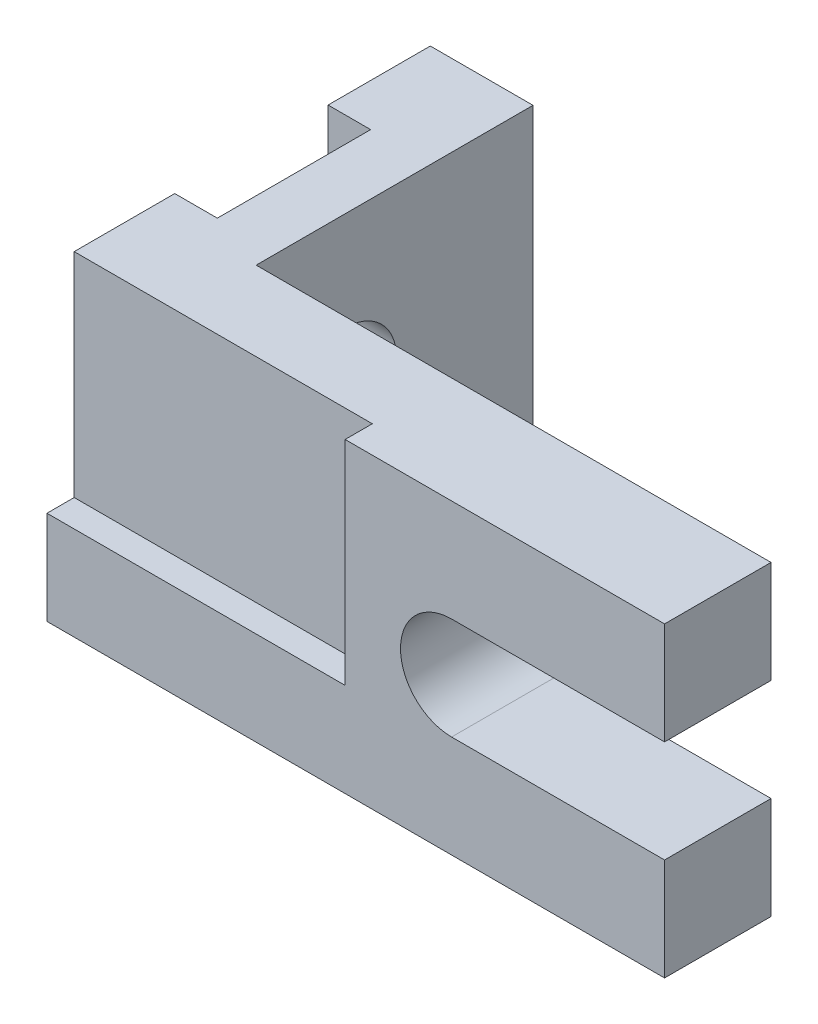
ISO-10303-21;
HEADER;
FILE_DESCRIPTION(('STEP AP214'),'2;1');
FILE_NAME('part.step','',(''),(''),'','','');
FILE_SCHEMA(('AUTOMOTIVE_DESIGN { 1 0 10303 214 1 1 1 1 }'));
ENDSEC;
DATA;
#1=APPLICATION_CONTEXT('core data for automotive mechanical design processes');
#2=APPLICATION_PROTOCOL_DEFINITION('international standard','automotive_design',2000,#1);
#3=PRODUCT_CONTEXT('',#1,'mechanical');
#4=PRODUCT('Part','Part','',(#3));
#5=PRODUCT_RELATED_PRODUCT_CATEGORY('part','',(#4));
#6=PRODUCT_DEFINITION_FORMATION('','',#4);
#7=PRODUCT_DEFINITION_CONTEXT('part definition',#1,'design');
#8=PRODUCT_DEFINITION('design','',#6,#7);
#9=PRODUCT_DEFINITION_SHAPE('','',#8);
#10=(LENGTH_UNIT() NAMED_UNIT(*) SI_UNIT(.MILLI.,.METRE.));
#11=(NAMED_UNIT(*) PLANE_ANGLE_UNIT() SI_UNIT($,.RADIAN.));
#12=(NAMED_UNIT(*) SI_UNIT($,.STERADIAN.) SOLID_ANGLE_UNIT());
#13=UNCERTAINTY_MEASURE_WITH_UNIT(LENGTH_MEASURE(1.E-05),#10,'distance_accuracy_value','');
#14=(GEOMETRIC_REPRESENTATION_CONTEXT(3) GLOBAL_UNCERTAINTY_ASSIGNED_CONTEXT((#13)) GLOBAL_UNIT_ASSIGNED_CONTEXT((#10,
#11,#12)) REPRESENTATION_CONTEXT('',''));
#15=CARTESIAN_POINT('',(0.,0.,0.));
#16=DIRECTION('',(0.,0.,1.));
#17=DIRECTION('',(1.,0.,0.));
#18=AXIS2_PLACEMENT_3D('',#15,#16,#17);
#19=CARTESIAN_POINT('',(0.,0.,0.));
#20=DIRECTION('',(0.,0.,-1.));
#21=DIRECTION('',(-1.,0.,0.));
#22=AXIS2_PLACEMENT_3D('',#19,#20,#21);
#23=PLANE('',#22);
#24=DIRECTION('',(0.,1.,0.));
#25=VECTOR('',#24,1.);
#26=CARTESIAN_POINT('',(145.,0.,0.));
#27=LINE('',#26,#25);
#28=CARTESIAN_POINT('',(145.,48.,0.));
#29=VERTEX_POINT('',#28);
#30=CARTESIAN_POINT('',(145.,72.,0.));
#31=VERTEX_POINT('',#30);
#32=EDGE_CURVE('E199',#29,#31,#27,.T.);
#33=ORIENTED_EDGE('',*,*,#32,.F.);
#34=DIRECTION('',(1.,0.,0.));
#35=VECTOR('',#34,1.);
#36=CARTESIAN_POINT('',(95.,48.,0.));
#37=LINE('',#36,#35);
#38=CARTESIAN_POINT('',(95.,48.,0.));
#39=VERTEX_POINT('',#38);
#40=EDGE_CURVE('E225',#39,#29,#37,.T.);
#41=ORIENTED_EDGE('',*,*,#40,.F.);
#42=CARTESIAN_POINT('',(95.,36.,0.));
#43=DIRECTION('',(0.,0.,-1.));
#44=DIRECTION('',(-1.,0.,0.));
#45=AXIS2_PLACEMENT_3D('',#42,#43,#44);
#46=CIRCLE('',#45,12.);
#47=CARTESIAN_POINT('',(95.,24.,0.));
#48=VERTEX_POINT('',#47);
#49=EDGE_CURVE('E205',#48,#39,#46,.T.);
#50=ORIENTED_EDGE('',*,*,#49,.F.);
#51=DIRECTION('',(-1.,0.,0.));
#52=VECTOR('',#51,1.);
#53=CARTESIAN_POINT('',(95.,24.,0.));
#54=LINE('',#53,#52);
#55=CARTESIAN_POINT('',(145.,24.,0.));
#56=VERTEX_POINT('',#55);
#57=EDGE_CURVE('E202',#56,#48,#54,.T.);
#58=ORIENTED_EDGE('',*,*,#57,.F.);
#59=CARTESIAN_POINT('',(145.,0.,0.));
#60=VERTEX_POINT('',#59);
#61=EDGE_CURVE('E188',#60,#56,#27,.T.);
#62=ORIENTED_EDGE('',*,*,#61,.F.);
#63=DIRECTION('',(1.,0.,0.));
#64=VECTOR('',#63,1.);
#65=CARTESIAN_POINT('',(0.,0.,0.));
#66=LINE('',#65,#64);
#67=CARTESIAN_POINT('',(24.1155063015069,0.,0.));
#68=VERTEX_POINT('',#67);
#69=EDGE_CURVE('E329',#68,#60,#66,.T.);
#70=ORIENTED_EDGE('',*,*,#69,.F.);
#71=DIRECTION('',(0.,1.,0.));
#72=VECTOR('',#71,1.);
#73=CARTESIAN_POINT('',(24.1155063015069,0.,0.));
#74=LINE('',#73,#72);
#75=CARTESIAN_POINT('',(24.1155063015069,72.,0.));
#76=VERTEX_POINT('',#75);
#77=EDGE_CURVE('E326',#68,#76,#74,.T.);
#78=ORIENTED_EDGE('',*,*,#77,.T.);
#79=DIRECTION('',(-1.,0.,0.));
#80=VECTOR('',#79,1.);
#81=CARTESIAN_POINT('',(0.,72.,0.));
#82=LINE('',#81,#80);
#83=EDGE_CURVE('E198',#31,#76,#82,.T.);
#84=ORIENTED_EDGE('',*,*,#83,.F.);
#85=EDGE_LOOP('',(#33,#41,#50,#58,#62,#70,#78,#84));
#86=FACE_BOUND('',#85,.T.);
#87=ADVANCED_FACE('F46',(#86),#23,.T.);
#88=CARTESIAN_POINT('',(145.,0.,25.));
#89=DIRECTION('',(-1.,0.,0.));
#90=DIRECTION('',(0.,0.,1.));
#91=AXIS2_PLACEMENT_3D('',#88,#89,#90);
#92=PLANE('',#91);
#93=DIRECTION('',(0.,0.,1.));
#94=VECTOR('',#93,1.);
#95=CARTESIAN_POINT('',(145.,48.,-254.795920504821));
#96=LINE('',#95,#94);
#97=CARTESIAN_POINT('',(145.,48.,25.));
#98=VERTEX_POINT('',#97);
#99=EDGE_CURVE('E215',#29,#98,#96,.T.);
#100=ORIENTED_EDGE('',*,*,#99,.F.);
#101=ORIENTED_EDGE('',*,*,#32,.T.);
#102=DIRECTION('',(0.,0.,-1.));
#103=VECTOR('',#102,1.);
#104=CARTESIAN_POINT('',(145.,72.,25.));
#105=LINE('',#104,#103);
#106=CARTESIAN_POINT('',(145.,72.,25.));
#107=VERTEX_POINT('',#106);
#108=EDGE_CURVE('E351',#107,#31,#105,.T.);
#109=ORIENTED_EDGE('',*,*,#108,.F.);
#110=DIRECTION('',(0.,1.,0.));
#111=VECTOR('',#110,1.);
#112=CARTESIAN_POINT('',(145.,0.,25.));
#113=LINE('',#112,#111);
#114=EDGE_CURVE('E339',#98,#107,#113,.T.);
#115=ORIENTED_EDGE('',*,*,#114,.F.);
#116=EDGE_LOOP('',(#100,#101,#109,#115));
#117=FACE_BOUND('',#116,.T.);
#118=ADVANCED_FACE('F381',(#117),#92,.F.);
#119=DIRECTION('',(0.,0.,1.));
#120=VECTOR('',#119,1.);
#121=CARTESIAN_POINT('',(145.,24.,-254.795920504821));
#122=LINE('',#121,#120);
#123=CARTESIAN_POINT('',(145.,24.,25.));
#124=VERTEX_POINT('',#123);
#125=EDGE_CURVE('E193',#56,#124,#122,.T.);
#126=ORIENTED_EDGE('',*,*,#125,.T.);
#127=CARTESIAN_POINT('',(145.,0.,25.));
#128=VERTEX_POINT('',#127);
#129=EDGE_CURVE('E340',#128,#124,#113,.T.);
#130=ORIENTED_EDGE('',*,*,#129,.F.);
#131=DIRECTION('',(0.,0.,-1.));
#132=VECTOR('',#131,1.);
#133=CARTESIAN_POINT('',(145.,0.,25.));
#134=LINE('',#133,#132);
#135=EDGE_CURVE('E195',#128,#60,#134,.T.);
#136=ORIENTED_EDGE('',*,*,#135,.T.);
#137=ORIENTED_EDGE('',*,*,#61,.T.);
#138=EDGE_LOOP('',(#126,#130,#136,#137));
#139=FACE_BOUND('',#138,.T.);
#140=ADVANCED_FACE('F190',(#139),#92,.F.);
#141=CARTESIAN_POINT('',(0.,0.,25.));
#142=DIRECTION('',(1.,0.,0.));
#143=DIRECTION('',(0.,0.,-1.));
#144=AXIS2_PLACEMENT_3D('',#141,#142,#143);
#145=PLANE('',#144);
#146=DIRECTION('',(0.,-1.,0.));
#147=VECTOR('',#146,1.);
#148=CARTESIAN_POINT('',(0.,393.533609871224,18.6098485068781));
#149=LINE('',#148,#147);
#150=CARTESIAN_POINT('',(0.,72.,18.6098485068781));
#151=VERTEX_POINT('',#150);
#152=CARTESIAN_POINT('',(0.,22.,18.6098485068781));
#153=VERTEX_POINT('',#152);
#154=EDGE_CURVE('E250',#151,#153,#149,.T.);
#155=ORIENTED_EDGE('',*,*,#154,.F.);
#156=DIRECTION('',(0.,0.,-1.));
#157=VECTOR('',#156,1.);
#158=CARTESIAN_POINT('',(0.,72.,25.));
#159=LINE('',#158,#157);
#160=CARTESIAN_POINT('',(0.,72.,-4.99999999999999));
#161=VERTEX_POINT('',#160);
#162=EDGE_CURVE('E349',#151,#161,#159,.T.);
#163=ORIENTED_EDGE('',*,*,#162,.T.);
#164=DIRECTION('',(0.,-1.,0.));
#165=VECTOR('',#164,1.);
#166=CARTESIAN_POINT('',(0.,0.,-4.99999999999999));
#167=LINE('',#166,#165);
#168=CARTESIAN_POINT('',(0.,61.9807621135332,-5.));
#169=VERTEX_POINT('',#168);
#170=EDGE_CURVE('E290',#161,#169,#167,.T.);
#171=ORIENTED_EDGE('',*,*,#170,.T.);
#172=CARTESIAN_POINT('',(0.,36.,-20.));
#173=DIRECTION('',(-1.,0.,0.));
#174=DIRECTION('',(0.,0.,1.));
#175=AXIS2_PLACEMENT_3D('',#172,#173,#174);
#176=CIRCLE('',#175,30.);
#177=CARTESIAN_POINT('',(0.,10.0192378864668,-4.99999999999999));
#178=VERTEX_POINT('',#177);
#179=EDGE_CURVE('E287',#178,#169,#176,.T.);
#180=ORIENTED_EDGE('',*,*,#179,.F.);
#181=DIRECTION('',(0.,-1.,0.));
#182=VECTOR('',#181,1.);
#183=CARTESIAN_POINT('',(0.,0.,-4.99999999999999));
#184=LINE('',#183,#182);
#185=CARTESIAN_POINT('',(0.,0.,-4.99999999999999));
#186=VERTEX_POINT('',#185);
#187=EDGE_CURVE('E256',#178,#186,#184,.T.);
#188=ORIENTED_EDGE('',*,*,#187,.T.);
#189=DIRECTION('',(0.,0.,-1.));
#190=VECTOR('',#189,1.);
#191=CARTESIAN_POINT('',(0.,0.,25.));
#192=LINE('',#191,#190);
#193=CARTESIAN_POINT('',(0.,0.,25.));
#194=VERTEX_POINT('',#193);
#195=EDGE_CURVE('E13',#194,#186,#192,.T.);
#196=ORIENTED_EDGE('',*,*,#195,.F.);
#197=DIRECTION('',(0.,-1.,0.));
#198=VECTOR('',#197,1.);
#199=CARTESIAN_POINT('',(0.,0.,25.));
#200=LINE('',#199,#198);
#201=CARTESIAN_POINT('',(0.,22.,25.));
#202=VERTEX_POINT('',#201);
#203=EDGE_CURVE('E335',#202,#194,#200,.T.);
#204=ORIENTED_EDGE('',*,*,#203,.F.);
#205=DIRECTION('',(0.,0.,-1.));
#206=VECTOR('',#205,1.);
#207=CARTESIAN_POINT('',(0.,22.,25.));
#208=LINE('',#207,#206);
#209=EDGE_CURVE('E233',#202,#153,#208,.T.);
#210=ORIENTED_EDGE('',*,*,#209,.T.);
#211=EDGE_LOOP('',(#155,#163,#171,#180,#188,#196,#204,#210));
#212=FACE_BOUND('',#211,.T.);
#213=ADVANCED_FACE('F409',(#212),#145,.F.);
#214=CARTESIAN_POINT('',(0.,72.,25.));
#215=DIRECTION('',(0.,-1.,0.));
#216=DIRECTION('',(0.,0.,-1.));
#217=AXIS2_PLACEMENT_3D('',#214,#215,#216);
#218=PLANE('',#217);
#219=DIRECTION('',(1.,0.,0.));
#220=VECTOR('',#219,1.);
#221=CARTESIAN_POINT('',(70.,72.,18.6098485068781));
#222=LINE('',#221,#220);
#223=CARTESIAN_POINT('',(70.,72.,18.6098485068781));
#224=VERTEX_POINT('',#223);
#225=EDGE_CURVE('E242',#151,#224,#222,.T.);
#226=ORIENTED_EDGE('',*,*,#225,.T.);
#227=DIRECTION('',(0.,0.,1.));
#228=VECTOR('',#227,1.);
#229=CARTESIAN_POINT('',(70.,72.,18.6098485068781));
#230=LINE('',#229,#228);
#231=CARTESIAN_POINT('',(70.,72.,25.));
#232=VERTEX_POINT('',#231);
#233=EDGE_CURVE('E241',#224,#232,#230,.T.);
#234=ORIENTED_EDGE('',*,*,#233,.T.);
#235=DIRECTION('',(-1.,0.,0.));
#236=VECTOR('',#235,1.);
#237=CARTESIAN_POINT('',(0.,72.,25.));
#238=LINE('',#237,#236);
#239=EDGE_CURVE('E342',#107,#232,#238,.T.);
#240=ORIENTED_EDGE('',*,*,#239,.F.);
#241=ORIENTED_EDGE('',*,*,#108,.T.);
#242=ORIENTED_EDGE('',*,*,#83,.T.);
#243=DIRECTION('',(0.,0.,1.));
#244=VECTOR('',#243,1.);
#245=CARTESIAN_POINT('',(24.1155063015069,72.,0.));
#246=LINE('',#245,#244);
#247=CARTESIAN_POINT('',(24.1155063015069,72.,-65.));
#248=VERTEX_POINT('',#247);
#249=EDGE_CURVE('E302',#248,#76,#246,.T.);
#250=ORIENTED_EDGE('',*,*,#249,.F.);
#251=DIRECTION('',(1.,0.,0.));
#252=VECTOR('',#251,1.);
#253=CARTESIAN_POINT('',(0.,72.,-65.));
#254=LINE('',#253,#252);
#255=CARTESIAN_POINT('',(0.,72.,-65.));
#256=VERTEX_POINT('',#255);
#257=EDGE_CURVE('E321',#256,#248,#254,.T.);
#258=ORIENTED_EDGE('',*,*,#257,.F.);
#259=CARTESIAN_POINT('',(0.,72.,-41.));
#260=VERTEX_POINT('',#259);
#261=EDGE_CURVE('E345',#260,#256,#159,.T.);
#262=ORIENTED_EDGE('',*,*,#261,.F.);
#263=DIRECTION('',(-1.,0.,0.));
#264=VECTOR('',#263,1.);
#265=CARTESIAN_POINT('',(10.,72.,-41.));
#266=LINE('',#265,#264);
#267=CARTESIAN_POINT('',(10.,72.,-41.));
#268=VERTEX_POINT('',#267);
#269=EDGE_CURVE('E310',#268,#260,#266,.T.);
#270=ORIENTED_EDGE('',*,*,#269,.F.);
#271=DIRECTION('',(0.,0.,-1.));
#272=VECTOR('',#271,1.);
#273=CARTESIAN_POINT('',(10.,72.,0.));
#274=LINE('',#273,#272);
#275=CARTESIAN_POINT('',(10.,72.,-4.99999999999999));
#276=VERTEX_POINT('',#275);
#277=EDGE_CURVE('E269',#276,#268,#274,.T.);
#278=ORIENTED_EDGE('',*,*,#277,.F.);
#279=DIRECTION('',(-1.,0.,0.));
#280=VECTOR('',#279,1.);
#281=CARTESIAN_POINT('',(10.,72.,-4.99999999999999));
#282=LINE('',#281,#280);
#283=EDGE_CURVE('E312',#276,#161,#282,.T.);
#284=ORIENTED_EDGE('',*,*,#283,.T.);
#285=ORIENTED_EDGE('',*,*,#162,.F.);
#286=EDGE_LOOP('',(#226,#234,#240,#241,#242,#250,#258,#262,#270,#278,#284,#285));
#287=FACE_BOUND('',#286,.T.);
#288=ADVANCED_FACE('F376',(#287),#218,.F.);
#289=CARTESIAN_POINT('',(0.,0.,25.));
#290=DIRECTION('',(0.,0.,-1.));
#291=DIRECTION('',(-1.,0.,0.));
#292=AXIS2_PLACEMENT_3D('',#289,#290,#291);
#293=PLANE('',#292);
#294=ORIENTED_EDGE('',*,*,#129,.T.);
#295=DIRECTION('',(-1.,0.,0.));
#296=VECTOR('',#295,1.);
#297=CARTESIAN_POINT('',(95.,24.,25.));
#298=LINE('',#297,#296);
#299=CARTESIAN_POINT('',(95.,24.,25.));
#300=VERTEX_POINT('',#299);
#301=EDGE_CURVE('E61',#124,#300,#298,.T.);
#302=ORIENTED_EDGE('',*,*,#301,.T.);
#303=CARTESIAN_POINT('',(95.,36.,25.));
#304=DIRECTION('',(0.,0.,-1.));
#305=DIRECTION('',(-1.,0.,0.));
#306=AXIS2_PLACEMENT_3D('',#303,#304,#305);
#307=CIRCLE('',#306,12.);
#308=CARTESIAN_POINT('',(95.,48.,25.));
#309=VERTEX_POINT('',#308);
#310=EDGE_CURVE('E65',#300,#309,#307,.T.);
#311=ORIENTED_EDGE('',*,*,#310,.T.);
#312=DIRECTION('',(1.,0.,0.));
#313=VECTOR('',#312,1.);
#314=CARTESIAN_POINT('',(95.,48.,25.));
#315=LINE('',#314,#313);
#316=EDGE_CURVE('E213',#309,#98,#315,.T.);
#317=ORIENTED_EDGE('',*,*,#316,.T.);
#318=ORIENTED_EDGE('',*,*,#114,.T.);
#319=ORIENTED_EDGE('',*,*,#239,.T.);
#320=DIRECTION('',(0.,-1.,0.));
#321=VECTOR('',#320,1.);
#322=CARTESIAN_POINT('',(70.,393.533609871224,25.));
#323=LINE('',#322,#321);
#324=CARTESIAN_POINT('',(70.,22.,25.));
#325=VERTEX_POINT('',#324);
#326=EDGE_CURVE('E237',#232,#325,#323,.T.);
#327=ORIENTED_EDGE('',*,*,#326,.T.);
#328=DIRECTION('',(-1.,0.,0.));
#329=VECTOR('',#328,1.);
#330=CARTESIAN_POINT('',(0.,22.,25.));
#331=LINE('',#330,#329);
#332=EDGE_CURVE('E245',#325,#202,#331,.T.);
#333=ORIENTED_EDGE('',*,*,#332,.T.);
#334=ORIENTED_EDGE('',*,*,#203,.T.);
#335=DIRECTION('',(1.,0.,0.));
#336=VECTOR('',#335,1.);
#337=CARTESIAN_POINT('',(0.,0.,25.));
#338=LINE('',#337,#336);
#339=EDGE_CURVE('E337',#194,#128,#338,.T.);
#340=ORIENTED_EDGE('',*,*,#339,.T.);
#341=EDGE_LOOP('',(#294,#302,#311,#317,#318,#319,#327,#333,#334,#340));
#342=FACE_BOUND('',#341,.T.);
#343=ADVANCED_FACE('F406',(#342),#293,.F.);
#344=CARTESIAN_POINT('',(0.,0.,25.));
#345=DIRECTION('',(0.,1.,0.));
#346=DIRECTION('',(0.,0.,1.));
#347=AXIS2_PLACEMENT_3D('',#344,#345,#346);
#348=PLANE('',#347);
#349=DIRECTION('',(-1.,0.,0.));
#350=VECTOR('',#349,1.);
#351=CARTESIAN_POINT('',(10.,0.,-4.99999999999999));
#352=LINE('',#351,#350);
#353=CARTESIAN_POINT('',(10.,0.,-4.99999999999999));
#354=VERTEX_POINT('',#353);
#355=EDGE_CURVE('E300',#354,#186,#352,.T.);
#356=ORIENTED_EDGE('',*,*,#355,.F.);
#357=DIRECTION('',(0.,0.,1.));
#358=VECTOR('',#357,1.);
#359=CARTESIAN_POINT('',(10.,0.,0.));
#360=LINE('',#359,#358);
#361=CARTESIAN_POINT('',(10.,0.,-41.));
#362=VERTEX_POINT('',#361);
#363=EDGE_CURVE('E281',#362,#354,#360,.T.);
#364=ORIENTED_EDGE('',*,*,#363,.F.);
#365=DIRECTION('',(-1.,0.,0.));
#366=VECTOR('',#365,1.);
#367=CARTESIAN_POINT('',(10.,0.,-41.));
#368=LINE('',#367,#366);
#369=CARTESIAN_POINT('',(0.,0.,-41.));
#370=VERTEX_POINT('',#369);
#371=EDGE_CURVE('E303',#362,#370,#368,.T.);
#372=ORIENTED_EDGE('',*,*,#371,.T.);
#373=CARTESIAN_POINT('',(0.,0.,-65.));
#374=VERTEX_POINT('',#373);
#375=EDGE_CURVE('E54',#370,#374,#192,.T.);
#376=ORIENTED_EDGE('',*,*,#375,.T.);
#377=DIRECTION('',(1.,0.,0.));
#378=VECTOR('',#377,1.);
#379=CARTESIAN_POINT('',(0.,0.,-65.));
#380=LINE('',#379,#378);
#381=CARTESIAN_POINT('',(24.1155063015069,0.,-65.));
#382=VERTEX_POINT('',#381);
#383=EDGE_CURVE('E320',#374,#382,#380,.T.);
#384=ORIENTED_EDGE('',*,*,#383,.T.);
#385=DIRECTION('',(0.,0.,1.));
#386=VECTOR('',#385,1.);
#387=CARTESIAN_POINT('',(24.1155063015069,0.,0.));
#388=LINE('',#387,#386);
#389=EDGE_CURVE('E318',#382,#68,#388,.T.);
#390=ORIENTED_EDGE('',*,*,#389,.T.);
#391=ORIENTED_EDGE('',*,*,#69,.T.);
#392=ORIENTED_EDGE('',*,*,#135,.F.);
#393=ORIENTED_EDGE('',*,*,#339,.F.);
#394=ORIENTED_EDGE('',*,*,#195,.T.);
#395=EDGE_LOOP('',(#356,#364,#372,#376,#384,#390,#391,#392,#393,#394));
#396=FACE_BOUND('',#395,.T.);
#397=ADVANCED_FACE('F357',(#396),#348,.F.);
#398=ORIENTED_EDGE('',*,*,#375,.F.);
#399=DIRECTION('',(0.,-1.,0.));
#400=VECTOR('',#399,1.);
#401=CARTESIAN_POINT('',(0.,0.,-41.));
#402=LINE('',#401,#400);
#403=CARTESIAN_POINT('',(0.,14.5757147143715,-41.));
#404=VERTEX_POINT('',#403);
#405=EDGE_CURVE('E264',#404,#370,#402,.T.);
#406=ORIENTED_EDGE('',*,*,#405,.F.);
#407=CARTESIAN_POINT('',(0.,36.,-20.));
#408=DIRECTION('',(-1.,0.,0.));
#409=DIRECTION('',(0.,0.,1.));
#410=AXIS2_PLACEMENT_3D('',#407,#408,#409);
#411=CIRCLE('',#410,30.);
#412=CARTESIAN_POINT('',(0.,57.4242852856285,-41.));
#413=VERTEX_POINT('',#412);
#414=EDGE_CURVE('E296',#413,#404,#411,.T.);
#415=ORIENTED_EDGE('',*,*,#414,.F.);
#416=DIRECTION('',(0.,-1.,0.));
#417=VECTOR('',#416,1.);
#418=CARTESIAN_POINT('',(0.,0.,-41.));
#419=LINE('',#418,#417);
#420=EDGE_CURVE('E293',#260,#413,#419,.T.);
#421=ORIENTED_EDGE('',*,*,#420,.F.);
#422=ORIENTED_EDGE('',*,*,#261,.T.);
#423=DIRECTION('',(0.,1.,0.));
#424=VECTOR('',#423,1.);
#425=CARTESIAN_POINT('',(0.,0.,-65.));
#426=LINE('',#425,#424);
#427=EDGE_CURVE('E330',#374,#256,#426,.T.);
#428=ORIENTED_EDGE('',*,*,#427,.F.);
#429=EDGE_LOOP('',(#398,#406,#415,#421,#422,#428));
#430=FACE_BOUND('',#429,.T.);
#431=ADVANCED_FACE('F48',(#430),#145,.F.);
#432=CARTESIAN_POINT('',(24.1155063015069,0.,0.));
#433=DIRECTION('',(-1.,0.,0.));
#434=DIRECTION('',(0.,0.,1.));
#435=AXIS2_PLACEMENT_3D('',#432,#433,#434);
#436=PLANE('',#435);
#437=CARTESIAN_POINT('',(24.1155063015069,36.7851439139719,-20.9421726967658));
#438=DIRECTION('',(-1.,0.,0.));
#439=DIRECTION('',(0.,0.,1.));
#440=AXIS2_PLACEMENT_3D('',#437,#438,#439);
#441=CIRCLE('',#440,12.);
#442=CARTESIAN_POINT('',(24.1155063015069,36.7851439139719,-8.94217269676579));
#443=VERTEX_POINT('',#442);
#444=EDGE_CURVE('E230',#443,#443,#441,.T.);
#445=ORIENTED_EDGE('',*,*,#444,.T.);
#446=EDGE_LOOP('',(#445));
#447=FACE_BOUND('',#446,.T.);
#448=ORIENTED_EDGE('',*,*,#249,.T.);
#449=ORIENTED_EDGE('',*,*,#77,.F.);
#450=ORIENTED_EDGE('',*,*,#389,.F.);
#451=DIRECTION('',(0.,1.,0.));
#452=VECTOR('',#451,1.);
#453=CARTESIAN_POINT('',(24.1155063015069,0.,-65.));
#454=LINE('',#453,#452);
#455=EDGE_CURVE('E323',#382,#248,#454,.T.);
#456=ORIENTED_EDGE('',*,*,#455,.T.);
#457=EDGE_LOOP('',(#448,#449,#450,#456));
#458=FACE_BOUND('',#457,.T.);
#459=ADVANCED_FACE('F372',(#447,#458),#436,.F.);
#460=CARTESIAN_POINT('',(0.,0.,-65.));
#461=DIRECTION('',(0.,0.,1.));
#462=DIRECTION('',(1.,0.,0.));
#463=AXIS2_PLACEMENT_3D('',#460,#461,#462);
#464=PLANE('',#463);
#465=ORIENTED_EDGE('',*,*,#257,.T.);
#466=ORIENTED_EDGE('',*,*,#455,.F.);
#467=ORIENTED_EDGE('',*,*,#383,.F.);
#468=ORIENTED_EDGE('',*,*,#427,.T.);
#469=EDGE_LOOP('',(#465,#466,#467,#468));
#470=FACE_BOUND('',#469,.T.);
#471=ADVANCED_FACE('F367',(#470),#464,.F.);
#472=CARTESIAN_POINT('',(10.,0.,-4.99999999999999));
#473=DIRECTION('',(0.,0.,-1.));
#474=DIRECTION('',(0.,1.,0.));
#475=AXIS2_PLACEMENT_3D('',#472,#473,#474);
#476=PLANE('',#475);
#477=ORIENTED_EDGE('',*,*,#187,.F.);
#478=DIRECTION('',(-1.,0.,0.));
#479=VECTOR('',#478,1.);
#480=CARTESIAN_POINT('',(10.,10.0192378864668,-4.99999999999999));
#481=LINE('',#480,#479);
#482=CARTESIAN_POINT('',(10.,10.0192378864668,-4.99999999999999));
#483=VERTEX_POINT('',#482);
#484=EDGE_CURVE('E284',#483,#178,#481,.T.);
#485=ORIENTED_EDGE('',*,*,#484,.F.);
#486=DIRECTION('',(0.,-1.,0.));
#487=VECTOR('',#486,1.);
#488=CARTESIAN_POINT('',(10.,0.,-4.99999999999999));
#489=LINE('',#488,#487);
#490=EDGE_CURVE('E261',#483,#354,#489,.T.);
#491=ORIENTED_EDGE('',*,*,#490,.T.);
#492=ORIENTED_EDGE('',*,*,#355,.T.);
#493=EDGE_LOOP('',(#477,#485,#491,#492));
#494=FACE_BOUND('',#493,.T.);
#495=ADVANCED_FACE('F424',(#494),#476,.T.);
#496=CARTESIAN_POINT('',(10.,0.,-41.));
#497=DIRECTION('',(0.,0.,-1.));
#498=DIRECTION('',(0.,1.,0.));
#499=AXIS2_PLACEMENT_3D('',#496,#497,#498);
#500=PLANE('',#499);
#501=ORIENTED_EDGE('',*,*,#405,.T.);
#502=ORIENTED_EDGE('',*,*,#371,.F.);
#503=DIRECTION('',(0.,-1.,0.));
#504=VECTOR('',#503,1.);
#505=CARTESIAN_POINT('',(10.,0.,-41.));
#506=LINE('',#505,#504);
#507=CARTESIAN_POINT('',(10.,14.5757147143715,-41.));
#508=VERTEX_POINT('',#507);
#509=EDGE_CURVE('E278',#508,#362,#506,.T.);
#510=ORIENTED_EDGE('',*,*,#509,.F.);
#511=DIRECTION('',(-1.,0.,0.));
#512=VECTOR('',#511,1.);
#513=CARTESIAN_POINT('',(10.,14.5757147143715,-41.));
#514=LINE('',#513,#512);
#515=EDGE_CURVE('E306',#508,#404,#514,.T.);
#516=ORIENTED_EDGE('',*,*,#515,.T.);
#517=EDGE_LOOP('',(#501,#502,#510,#516));
#518=FACE_BOUND('',#517,.T.);
#519=ADVANCED_FACE('F432',(#518),#500,.F.);
#520=CARTESIAN_POINT('',(10.,36.,-20.));
#521=DIRECTION('',(-1.,0.,0.));
#522=DIRECTION('',(0.,0.,1.));
#523=AXIS2_PLACEMENT_3D('',#520,#521,#522);
#524=CYLINDRICAL_SURFACE('',#523,30.);
#525=ORIENTED_EDGE('',*,*,#414,.T.);
#526=ORIENTED_EDGE('',*,*,#515,.F.);
#527=CARTESIAN_POINT('',(10.,36.,-20.));
#528=DIRECTION('',(-1.,0.,0.));
#529=DIRECTION('',(0.,0.,1.));
#530=AXIS2_PLACEMENT_3D('',#527,#528,#529);
#531=CIRCLE('',#530,30.);
#532=CARTESIAN_POINT('',(10.,57.4242852856285,-41.));
#533=VERTEX_POINT('',#532);
#534=EDGE_CURVE('E275',#533,#508,#531,.T.);
#535=ORIENTED_EDGE('',*,*,#534,.F.);
#536=DIRECTION('',(-1.,0.,0.));
#537=VECTOR('',#536,1.);
#538=CARTESIAN_POINT('',(10.,57.4242852856285,-41.));
#539=LINE('',#538,#537);
#540=EDGE_CURVE('E308',#533,#413,#539,.T.);
#541=ORIENTED_EDGE('',*,*,#540,.T.);
#542=EDGE_LOOP('',(#525,#526,#535,#541));
#543=FACE_BOUND('',#542,.T.);
#544=ADVANCED_FACE('F435',(#543),#524,.F.);
#545=CARTESIAN_POINT('',(10.,0.,-41.));
#546=DIRECTION('',(0.,0.,-1.));
#547=DIRECTION('',(0.,1.,0.));
#548=AXIS2_PLACEMENT_3D('',#545,#546,#547);
#549=PLANE('',#548);
#550=ORIENTED_EDGE('',*,*,#420,.T.);
#551=ORIENTED_EDGE('',*,*,#540,.F.);
#552=DIRECTION('',(0.,-1.,0.));
#553=VECTOR('',#552,1.);
#554=CARTESIAN_POINT('',(10.,0.,-41.));
#555=LINE('',#554,#553);
#556=EDGE_CURVE('E272',#268,#533,#555,.T.);
#557=ORIENTED_EDGE('',*,*,#556,.F.);
#558=ORIENTED_EDGE('',*,*,#269,.T.);
#559=EDGE_LOOP('',(#550,#551,#557,#558));
#560=FACE_BOUND('',#559,.T.);
#561=ADVANCED_FACE('F437',(#560),#549,.F.);
#562=CARTESIAN_POINT('',(10.,0.,-4.99999999999999));
#563=DIRECTION('',(0.,0.,-1.));
#564=DIRECTION('',(0.,1.,0.));
#565=AXIS2_PLACEMENT_3D('',#562,#563,#564);
#566=PLANE('',#565);
#567=ORIENTED_EDGE('',*,*,#170,.F.);
#568=ORIENTED_EDGE('',*,*,#283,.F.);
#569=DIRECTION('',(0.,-1.,0.));
#570=VECTOR('',#569,1.);
#571=CARTESIAN_POINT('',(10.,0.,-4.99999999999999));
#572=LINE('',#571,#570);
#573=CARTESIAN_POINT('',(10.,61.9807621135332,-5.));
#574=VERTEX_POINT('',#573);
#575=EDGE_CURVE('E267',#276,#574,#572,.T.);
#576=ORIENTED_EDGE('',*,*,#575,.T.);
#577=DIRECTION('',(-1.,0.,0.));
#578=VECTOR('',#577,1.);
#579=CARTESIAN_POINT('',(10.,61.9807621135332,-5.));
#580=LINE('',#579,#578);
#581=EDGE_CURVE('E315',#574,#169,#580,.T.);
#582=ORIENTED_EDGE('',*,*,#581,.T.);
#583=EDGE_LOOP('',(#567,#568,#576,#582));
#584=FACE_BOUND('',#583,.T.);
#585=ADVANCED_FACE('F445',(#584),#566,.T.);
#586=CARTESIAN_POINT('',(10.,36.,-20.));
#587=DIRECTION('',(-1.,0.,0.));
#588=DIRECTION('',(0.,0.,1.));
#589=AXIS2_PLACEMENT_3D('',#586,#587,#588);
#590=CYLINDRICAL_SURFACE('',#589,30.);
#591=ORIENTED_EDGE('',*,*,#179,.T.);
#592=ORIENTED_EDGE('',*,*,#581,.F.);
#593=CARTESIAN_POINT('',(10.,36.,-20.));
#594=DIRECTION('',(-1.,0.,0.));
#595=DIRECTION('',(0.,0.,1.));
#596=AXIS2_PLACEMENT_3D('',#593,#594,#595);
#597=CIRCLE('',#596,30.);
#598=EDGE_CURVE('E263',#483,#574,#597,.T.);
#599=ORIENTED_EDGE('',*,*,#598,.F.);
#600=ORIENTED_EDGE('',*,*,#484,.T.);
#601=EDGE_LOOP('',(#591,#592,#599,#600));
#602=FACE_BOUND('',#601,.T.);
#603=ADVANCED_FACE('F466',(#602),#590,.F.);
#604=CARTESIAN_POINT('',(10.,0.,0.));
#605=DIRECTION('',(-1.,0.,0.));
#606=DIRECTION('',(0.,0.,1.));
#607=AXIS2_PLACEMENT_3D('',#604,#605,#606);
#608=PLANE('',#607);
#609=CARTESIAN_POINT('',(10.,36.7851439139719,-20.9421726967658));
#610=DIRECTION('',(-1.,0.,0.));
#611=DIRECTION('',(0.,0.,1.));
#612=AXIS2_PLACEMENT_3D('',#609,#610,#611);
#613=CIRCLE('',#612,12.);
#614=CARTESIAN_POINT('',(10.,36.7851439139719,-8.94217269676579));
#615=VERTEX_POINT('',#614);
#616=EDGE_CURVE('E209',#615,#615,#613,.T.);
#617=ORIENTED_EDGE('',*,*,#616,.F.);
#618=EDGE_LOOP('',(#617));
#619=FACE_BOUND('',#618,.T.);
#620=ORIENTED_EDGE('',*,*,#490,.F.);
#621=ORIENTED_EDGE('',*,*,#598,.T.);
#622=ORIENTED_EDGE('',*,*,#575,.F.);
#623=ORIENTED_EDGE('',*,*,#277,.T.);
#624=ORIENTED_EDGE('',*,*,#556,.T.);
#625=ORIENTED_EDGE('',*,*,#534,.T.);
#626=ORIENTED_EDGE('',*,*,#509,.T.);
#627=ORIENTED_EDGE('',*,*,#363,.T.);
#628=EDGE_LOOP('',(#620,#621,#622,#623,#624,#625,#626,#627));
#629=FACE_BOUND('',#628,.T.);
#630=ADVANCED_FACE('F427',(#619,#629),#608,.T.);
#631=CARTESIAN_POINT('',(70.,393.533609871224,18.6098485068781));
#632=DIRECTION('',(0.,0.,1.));
#633=DIRECTION('',(1.,0.,0.));
#634=AXIS2_PLACEMENT_3D('',#631,#632,#633);
#635=PLANE('',#634);
#636=ORIENTED_EDGE('',*,*,#225,.F.);
#637=ORIENTED_EDGE('',*,*,#154,.T.);
#638=DIRECTION('',(1.,0.,0.));
#639=VECTOR('',#638,1.);
#640=CARTESIAN_POINT('',(70.,22.,18.6098485068781));
#641=LINE('',#640,#639);
#642=CARTESIAN_POINT('',(70.,22.,18.6098485068781));
#643=VERTEX_POINT('',#642);
#644=EDGE_CURVE('E234',#153,#643,#641,.T.);
#645=ORIENTED_EDGE('',*,*,#644,.T.);
#646=DIRECTION('',(0.,-1.,0.));
#647=VECTOR('',#646,1.);
#648=CARTESIAN_POINT('',(70.,393.533609871224,18.6098485068781));
#649=LINE('',#648,#647);
#650=EDGE_CURVE('E253',#224,#643,#649,.T.);
#651=ORIENTED_EDGE('',*,*,#650,.F.);
#652=EDGE_LOOP('',(#636,#637,#645,#651));
#653=FACE_BOUND('',#652,.T.);
#654=ADVANCED_FACE('F448',(#653),#635,.T.);
#655=CARTESIAN_POINT('',(70.,393.533609871224,18.6098485068781));
#656=DIRECTION('',(-1.,0.,0.));
#657=DIRECTION('',(0.,0.,1.));
#658=AXIS2_PLACEMENT_3D('',#655,#656,#657);
#659=PLANE('',#658);
#660=ORIENTED_EDGE('',*,*,#233,.F.);
#661=ORIENTED_EDGE('',*,*,#650,.T.);
#662=DIRECTION('',(0.,0.,1.));
#663=VECTOR('',#662,1.);
#664=CARTESIAN_POINT('',(70.,22.,18.6098485068781));
#665=LINE('',#664,#663);
#666=EDGE_CURVE('E238',#643,#325,#665,.T.);
#667=ORIENTED_EDGE('',*,*,#666,.T.);
#668=ORIENTED_EDGE('',*,*,#326,.F.);
#669=EDGE_LOOP('',(#660,#661,#667,#668));
#670=FACE_BOUND('',#669,.T.);
#671=ADVANCED_FACE('F450',(#670),#659,.T.);
#672=CARTESIAN_POINT('',(0.,22.,25.));
#673=DIRECTION('',(0.,-1.,0.));
#674=DIRECTION('',(0.,0.,-1.));
#675=AXIS2_PLACEMENT_3D('',#672,#673,#674);
#676=PLANE('',#675);
#677=ORIENTED_EDGE('',*,*,#332,.F.);
#678=ORIENTED_EDGE('',*,*,#666,.F.);
#679=ORIENTED_EDGE('',*,*,#644,.F.);
#680=ORIENTED_EDGE('',*,*,#209,.F.);
#681=EDGE_LOOP('',(#677,#678,#679,#680));
#682=FACE_BOUND('',#681,.T.);
#683=ADVANCED_FACE('F452',(#682),#676,.F.);
#684=CARTESIAN_POINT('',(34.,36.7851439139719,-20.9421726967658));
#685=DIRECTION('',(-1.,0.,0.));
#686=DIRECTION('',(0.,0.,1.));
#687=AXIS2_PLACEMENT_3D('',#684,#685,#686);
#688=CYLINDRICAL_SURFACE('',#687,12.);
#689=ORIENTED_EDGE('',*,*,#616,.T.);
#690=EDGE_LOOP('',(#689));
#691=FACE_BOUND('',#690,.T.);
#692=ORIENTED_EDGE('',*,*,#444,.F.);
#693=EDGE_LOOP('',(#692));
#694=FACE_BOUND('',#693,.T.);
#695=ADVANCED_FACE('F396',(#691,#694),#688,.F.);
#696=CARTESIAN_POINT('',(95.,48.,-254.795920504821));
#697=DIRECTION('',(0.,-1.,0.));
#698=DIRECTION('',(0.,0.,-1.));
#699=AXIS2_PLACEMENT_3D('',#696,#697,#698);
#700=PLANE('',#699);
#701=DIRECTION('',(0.,0.,1.));
#702=VECTOR('',#701,1.);
#703=CARTESIAN_POINT('',(95.,48.,-254.795920504821));
#704=LINE('',#703,#702);
#705=EDGE_CURVE('E222',#39,#309,#704,.T.);
#706=ORIENTED_EDGE('',*,*,#705,.F.);
#707=ORIENTED_EDGE('',*,*,#40,.T.);
#708=ORIENTED_EDGE('',*,*,#99,.T.);
#709=ORIENTED_EDGE('',*,*,#316,.F.);
#710=EDGE_LOOP('',(#706,#707,#708,#709));
#711=FACE_BOUND('',#710,.T.);
#712=ADVANCED_FACE('F384',(#711),#700,.T.);
#713=CARTESIAN_POINT('',(95.,36.,-254.795920504821));
#714=DIRECTION('',(0.,0.,1.));
#715=DIRECTION('',(1.,0.,0.));
#716=AXIS2_PLACEMENT_3D('',#713,#714,#715);
#717=CYLINDRICAL_SURFACE('',#716,12.);
#718=DIRECTION('',(0.,0.,1.));
#719=VECTOR('',#718,1.);
#720=CARTESIAN_POINT('',(95.,24.,-254.795920504821));
#721=LINE('',#720,#719);
#722=EDGE_CURVE('E212',#48,#300,#721,.T.);
#723=ORIENTED_EDGE('',*,*,#722,.F.);
#724=ORIENTED_EDGE('',*,*,#49,.T.);
#725=ORIENTED_EDGE('',*,*,#705,.T.);
#726=ORIENTED_EDGE('',*,*,#310,.F.);
#727=EDGE_LOOP('',(#723,#724,#725,#726));
#728=FACE_BOUND('',#727,.T.);
#729=ADVANCED_FACE('F386',(#728),#717,.F.);
#730=CARTESIAN_POINT('',(95.,24.,-254.795920504821));
#731=DIRECTION('',(0.,1.,0.));
#732=DIRECTION('',(-1.,0.,0.));
#733=AXIS2_PLACEMENT_3D('',#730,#731,#732);
#734=PLANE('',#733);
#735=ORIENTED_EDGE('',*,*,#125,.F.);
#736=ORIENTED_EDGE('',*,*,#57,.T.);
#737=ORIENTED_EDGE('',*,*,#722,.T.);
#738=ORIENTED_EDGE('',*,*,#301,.F.);
#739=EDGE_LOOP('',(#735,#736,#737,#738));
#740=FACE_BOUND('',#739,.T.);
#741=ADVANCED_FACE('F211',(#740),#734,.T.);
#742=CLOSED_SHELL('',(#87,#118,#140,#213,#288,#343,#397,#431,#459,#471,#495,#519,#544,#561,#585,
#603,#630,#654,#671,#683,#695,#712,#729,#741));
#743=MANIFOLD_SOLID_BREP('B2',#742);
#744=ADVANCED_BREP_SHAPE_REPRESENTATION('',(#18,#743),#14);
#745=SHAPE_DEFINITION_REPRESENTATION(#9,#744);
ENDSEC;
END-ISO-10303-21;
